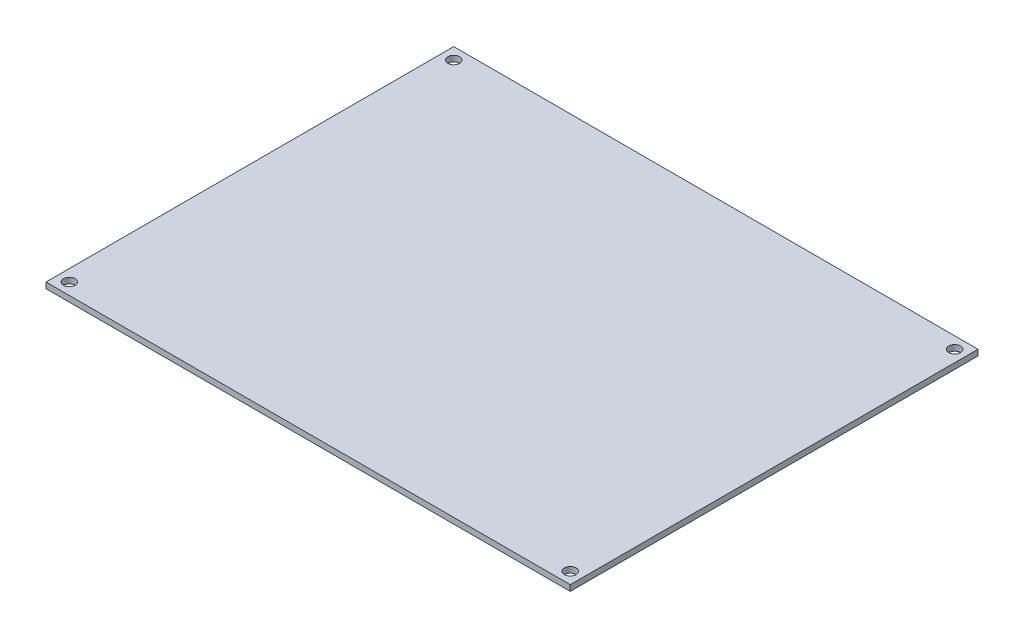
ISO-10303-21;
HEADER;
FILE_DESCRIPTION(('STEP AP214'),'2;1');
FILE_NAME('part.step','',(''),(''),'','','');
FILE_SCHEMA(('AUTOMOTIVE_DESIGN { 1 0 10303 214 1 1 1 1 }'));
ENDSEC;
DATA;
#1=APPLICATION_CONTEXT('core data for automotive mechanical design processes');
#2=APPLICATION_PROTOCOL_DEFINITION('international standard','automotive_design',2000,#1);
#3=PRODUCT_CONTEXT('',#1,'mechanical');
#4=PRODUCT('Part','Part','',(#3));
#5=PRODUCT_RELATED_PRODUCT_CATEGORY('part','',(#4));
#6=PRODUCT_DEFINITION_FORMATION('','',#4);
#7=PRODUCT_DEFINITION_CONTEXT('part definition',#1,'design');
#8=PRODUCT_DEFINITION('design','',#6,#7);
#9=PRODUCT_DEFINITION_SHAPE('','',#8);
#10=(LENGTH_UNIT() NAMED_UNIT(*) SI_UNIT(.MILLI.,.METRE.));
#11=(NAMED_UNIT(*) PLANE_ANGLE_UNIT() SI_UNIT($,.RADIAN.));
#12=(NAMED_UNIT(*) SI_UNIT($,.STERADIAN.) SOLID_ANGLE_UNIT());
#13=UNCERTAINTY_MEASURE_WITH_UNIT(LENGTH_MEASURE(1.E-05),#10,'distance_accuracy_value','');
#14=(GEOMETRIC_REPRESENTATION_CONTEXT(3) GLOBAL_UNCERTAINTY_ASSIGNED_CONTEXT((#13)) GLOBAL_UNIT_ASSIGNED_CONTEXT((#10,
#11,#12)) REPRESENTATION_CONTEXT('',''));
#15=CARTESIAN_POINT('',(0.,0.,0.));
#16=DIRECTION('',(0.,0.,1.));
#17=DIRECTION('',(1.,0.,0.));
#18=AXIS2_PLACEMENT_3D('',#15,#16,#17);
#19=CARTESIAN_POINT('',(0.,1.,0.));
#20=DIRECTION('',(1.,0.,0.));
#21=DIRECTION('',(0.,0.,-1.));
#22=AXIS2_PLACEMENT_3D('',#19,#20,#21);
#23=PLANE('',#22);
#24=DIRECTION('',(0.,0.,1.));
#25=VECTOR('',#24,1.);
#26=CARTESIAN_POINT('',(0.,0.,0.));
#27=LINE('',#26,#25);
#28=CARTESIAN_POINT('',(0.,0.,-70.));
#29=VERTEX_POINT('',#28);
#30=CARTESIAN_POINT('',(0.,0.,0.));
#31=VERTEX_POINT('',#30);
#32=EDGE_CURVE('E110',#29,#31,#27,.T.);
#33=ORIENTED_EDGE('',*,*,#32,.T.);
#34=DIRECTION('',(0.,-1.,0.));
#35=VECTOR('',#34,1.);
#36=CARTESIAN_POINT('',(0.,1.,0.));
#37=LINE('',#36,#35);
#38=CARTESIAN_POINT('',(0.,1.,0.));
#39=VERTEX_POINT('',#38);
#40=EDGE_CURVE('E11',#39,#31,#37,.T.);
#41=ORIENTED_EDGE('',*,*,#40,.F.);
#42=DIRECTION('',(0.,0.,1.));
#43=VECTOR('',#42,1.);
#44=CARTESIAN_POINT('',(0.,1.,0.));
#45=LINE('',#44,#43);
#46=CARTESIAN_POINT('',(0.,1.,-70.));
#47=VERTEX_POINT('',#46);
#48=EDGE_CURVE('E97',#47,#39,#45,.T.);
#49=ORIENTED_EDGE('',*,*,#48,.F.);
#50=DIRECTION('',(0.,-1.,0.));
#51=VECTOR('',#50,1.);
#52=CARTESIAN_POINT('',(0.,1.,-70.));
#53=LINE('',#52,#51);
#54=EDGE_CURVE('E106',#47,#29,#53,.T.);
#55=ORIENTED_EDGE('',*,*,#54,.T.);
#56=EDGE_LOOP('',(#33,#41,#49,#55));
#57=FACE_BOUND('',#56,.T.);
#58=ADVANCED_FACE('F44',(#57),#23,.F.);
#59=CARTESIAN_POINT('',(0.,1.,0.));
#60=DIRECTION('',(0.,0.,-1.));
#61=DIRECTION('',(-1.,0.,0.));
#62=AXIS2_PLACEMENT_3D('',#59,#60,#61);
#63=PLANE('',#62);
#64=DIRECTION('',(1.,0.,0.));
#65=VECTOR('',#64,1.);
#66=CARTESIAN_POINT('',(0.,0.,0.));
#67=LINE('',#66,#65);
#68=CARTESIAN_POINT('',(90.,0.,0.));
#69=VERTEX_POINT('',#68);
#70=EDGE_CURVE('E101',#31,#69,#67,.T.);
#71=ORIENTED_EDGE('',*,*,#70,.T.);
#72=DIRECTION('',(0.,-1.,0.));
#73=VECTOR('',#72,1.);
#74=CARTESIAN_POINT('',(90.,1.,0.));
#75=LINE('',#74,#73);
#76=CARTESIAN_POINT('',(90.,1.,0.));
#77=VERTEX_POINT('',#76);
#78=EDGE_CURVE('E53',#77,#69,#75,.T.);
#79=ORIENTED_EDGE('',*,*,#78,.F.);
#80=DIRECTION('',(1.,0.,0.));
#81=VECTOR('',#80,1.);
#82=CARTESIAN_POINT('',(0.,1.,0.));
#83=LINE('',#82,#81);
#84=EDGE_CURVE('E92',#39,#77,#83,.T.);
#85=ORIENTED_EDGE('',*,*,#84,.F.);
#86=ORIENTED_EDGE('',*,*,#40,.T.);
#87=EDGE_LOOP('',(#71,#79,#85,#86));
#88=FACE_BOUND('',#87,.T.);
#89=ADVANCED_FACE('F100',(#88),#63,.F.);
#90=CARTESIAN_POINT('',(90.,1.,0.));
#91=DIRECTION('',(-1.,0.,0.));
#92=DIRECTION('',(0.,0.,1.));
#93=AXIS2_PLACEMENT_3D('',#90,#91,#92);
#94=PLANE('',#93);
#95=DIRECTION('',(0.,0.,-1.));
#96=VECTOR('',#95,1.);
#97=CARTESIAN_POINT('',(90.,0.,0.));
#98=LINE('',#97,#96);
#99=CARTESIAN_POINT('',(90.,0.,-70.));
#100=VERTEX_POINT('',#99);
#101=EDGE_CURVE('E79',#69,#100,#98,.T.);
#102=ORIENTED_EDGE('',*,*,#101,.T.);
#103=DIRECTION('',(0.,-1.,0.));
#104=VECTOR('',#103,1.);
#105=CARTESIAN_POINT('',(90.,1.,-70.));
#106=LINE('',#105,#104);
#107=CARTESIAN_POINT('',(90.,1.,-70.));
#108=VERTEX_POINT('',#107);
#109=EDGE_CURVE('E102',#108,#100,#106,.T.);
#110=ORIENTED_EDGE('',*,*,#109,.F.);
#111=DIRECTION('',(0.,0.,-1.));
#112=VECTOR('',#111,1.);
#113=CARTESIAN_POINT('',(90.,1.,0.));
#114=LINE('',#113,#112);
#115=EDGE_CURVE('E95',#77,#108,#114,.T.);
#116=ORIENTED_EDGE('',*,*,#115,.F.);
#117=ORIENTED_EDGE('',*,*,#78,.T.);
#118=EDGE_LOOP('',(#102,#110,#116,#117));
#119=FACE_BOUND('',#118,.T.);
#120=ADVANCED_FACE('F104',(#119),#94,.F.);
#121=CARTESIAN_POINT('',(0.,1.,-70.));
#122=DIRECTION('',(0.,0.,1.));
#123=DIRECTION('',(1.,0.,0.));
#124=AXIS2_PLACEMENT_3D('',#121,#122,#123);
#125=PLANE('',#124);
#126=DIRECTION('',(-1.,0.,0.));
#127=VECTOR('',#126,1.);
#128=CARTESIAN_POINT('',(0.,0.,-70.));
#129=LINE('',#128,#127);
#130=EDGE_CURVE('E85',#100,#29,#129,.T.);
#131=ORIENTED_EDGE('',*,*,#130,.T.);
#132=ORIENTED_EDGE('',*,*,#54,.F.);
#133=DIRECTION('',(-1.,0.,0.));
#134=VECTOR('',#133,1.);
#135=CARTESIAN_POINT('',(0.,1.,-70.));
#136=LINE('',#135,#134);
#137=EDGE_CURVE('E62',#108,#47,#136,.T.);
#138=ORIENTED_EDGE('',*,*,#137,.F.);
#139=ORIENTED_EDGE('',*,*,#109,.T.);
#140=EDGE_LOOP('',(#131,#132,#138,#139));
#141=FACE_BOUND('',#140,.T.);
#142=ADVANCED_FACE('F146',(#141),#125,.F.);
#143=CARTESIAN_POINT('',(0.,1.,0.));
#144=DIRECTION('',(0.,-1.,0.));
#145=DIRECTION('',(0.,0.,-1.));
#146=AXIS2_PLACEMENT_3D('',#143,#144,#145);
#147=PLANE('',#146);
#148=CARTESIAN_POINT('',(2.,1.,-68.));
#149=DIRECTION('',(0.,1.,0.));
#150=DIRECTION('',(0.,0.,1.));
#151=AXIS2_PLACEMENT_3D('',#148,#149,#150);
#152=CIRCLE('',#151,1.);
#153=CARTESIAN_POINT('',(2.,1.,-67.));
#154=VERTEX_POINT('',#153);
#155=EDGE_CURVE('E254',#154,#154,#152,.T.);
#156=ORIENTED_EDGE('',*,*,#155,.F.);
#157=EDGE_LOOP('',(#156));
#158=FACE_BOUND('',#157,.T.);
#159=CARTESIAN_POINT('',(2.,1.,-2.00000000000001));
#160=DIRECTION('',(0.,1.,0.));
#161=DIRECTION('',(0.,0.,1.));
#162=AXIS2_PLACEMENT_3D('',#159,#160,#161);
#163=CIRCLE('',#162,1.);
#164=CARTESIAN_POINT('',(2.,1.,-1.00000000000001));
#165=VERTEX_POINT('',#164);
#166=EDGE_CURVE('E251',#165,#165,#163,.T.);
#167=ORIENTED_EDGE('',*,*,#166,.F.);
#168=EDGE_LOOP('',(#167));
#169=FACE_BOUND('',#168,.T.);
#170=CARTESIAN_POINT('',(88.,1.,-2.00000000000001));
#171=DIRECTION('',(0.,1.,0.));
#172=DIRECTION('',(0.,0.,1.));
#173=AXIS2_PLACEMENT_3D('',#170,#171,#172);
#174=CIRCLE('',#173,0.999999999999998);
#175=CARTESIAN_POINT('',(88.,1.,-1.00000000000001));
#176=VERTEX_POINT('',#175);
#177=EDGE_CURVE('E253',#176,#176,#174,.T.);
#178=ORIENTED_EDGE('',*,*,#177,.F.);
#179=EDGE_LOOP('',(#178));
#180=FACE_BOUND('',#179,.T.);
#181=CARTESIAN_POINT('',(88.,1.,-68.));
#182=DIRECTION('',(0.,1.,0.));
#183=DIRECTION('',(0.,0.,1.));
#184=AXIS2_PLACEMENT_3D('',#181,#182,#183);
#185=CIRCLE('',#184,0.999999999999998);
#186=CARTESIAN_POINT('',(88.,1.,-67.));
#187=VERTEX_POINT('',#186);
#188=EDGE_CURVE('E122',#187,#187,#185,.T.);
#189=ORIENTED_EDGE('',*,*,#188,.F.);
#190=EDGE_LOOP('',(#189));
#191=FACE_BOUND('',#190,.T.);
#192=ORIENTED_EDGE('',*,*,#48,.T.);
#193=ORIENTED_EDGE('',*,*,#84,.T.);
#194=ORIENTED_EDGE('',*,*,#115,.T.);
#195=ORIENTED_EDGE('',*,*,#137,.T.);
#196=EDGE_LOOP('',(#192,#193,#194,#195));
#197=FACE_BOUND('',#196,.T.);
#198=ADVANCED_FACE('F93',(#158,#169,#180,#191,#197),#147,.F.);
#199=CARTESIAN_POINT('',(0.,0.,0.));
#200=DIRECTION('',(0.,-1.,0.));
#201=DIRECTION('',(0.,0.,-1.));
#202=AXIS2_PLACEMENT_3D('',#199,#200,#201);
#203=PLANE('',#202);
#204=CARTESIAN_POINT('',(2.,0.,-68.));
#205=DIRECTION('',(0.,-1.,0.));
#206=DIRECTION('',(0.,0.,-1.));
#207=AXIS2_PLACEMENT_3D('',#204,#205,#206);
#208=CIRCLE('',#207,1.);
#209=CARTESIAN_POINT('',(2.,0.,-69.));
#210=VERTEX_POINT('',#209);
#211=EDGE_CURVE('E47',#210,#210,#208,.T.);
#212=ORIENTED_EDGE('',*,*,#211,.F.);
#213=EDGE_LOOP('',(#212));
#214=FACE_BOUND('',#213,.T.);
#215=CARTESIAN_POINT('',(2.,0.,-2.00000000000001));
#216=DIRECTION('',(0.,-1.,0.));
#217=DIRECTION('',(0.,0.,-1.));
#218=AXIS2_PLACEMENT_3D('',#215,#216,#217);
#219=CIRCLE('',#218,1.);
#220=CARTESIAN_POINT('',(2.,0.,-3.00000000000001));
#221=VERTEX_POINT('',#220);
#222=EDGE_CURVE('E124',#221,#221,#219,.T.);
#223=ORIENTED_EDGE('',*,*,#222,.F.);
#224=EDGE_LOOP('',(#223));
#225=FACE_BOUND('',#224,.T.);
#226=CARTESIAN_POINT('',(88.,0.,-2.00000000000001));
#227=DIRECTION('',(0.,-1.,0.));
#228=DIRECTION('',(0.,0.,-1.));
#229=AXIS2_PLACEMENT_3D('',#226,#227,#228);
#230=CIRCLE('',#229,0.999999999999998);
#231=CARTESIAN_POINT('',(88.,0.,-3.00000000000001));
#232=VERTEX_POINT('',#231);
#233=EDGE_CURVE('E121',#232,#232,#230,.T.);
#234=ORIENTED_EDGE('',*,*,#233,.F.);
#235=EDGE_LOOP('',(#234));
#236=FACE_BOUND('',#235,.T.);
#237=CARTESIAN_POINT('',(88.,0.,-68.));
#238=DIRECTION('',(0.,-1.,0.));
#239=DIRECTION('',(0.,0.,-1.));
#240=AXIS2_PLACEMENT_3D('',#237,#238,#239);
#241=CIRCLE('',#240,0.999999999999998);
#242=CARTESIAN_POINT('',(88.,0.,-69.));
#243=VERTEX_POINT('',#242);
#244=EDGE_CURVE('E118',#243,#243,#241,.T.);
#245=ORIENTED_EDGE('',*,*,#244,.F.);
#246=EDGE_LOOP('',(#245));
#247=FACE_BOUND('',#246,.T.);
#248=ORIENTED_EDGE('',*,*,#32,.F.);
#249=ORIENTED_EDGE('',*,*,#130,.F.);
#250=ORIENTED_EDGE('',*,*,#101,.F.);
#251=ORIENTED_EDGE('',*,*,#70,.F.);
#252=EDGE_LOOP('',(#248,#249,#250,#251));
#253=FACE_BOUND('',#252,.T.);
#254=ADVANCED_FACE('F134',(#214,#225,#236,#247,#253),#203,.T.);
#255=CARTESIAN_POINT('',(88.,-9.,-68.));
#256=DIRECTION('',(0.,1.,0.));
#257=DIRECTION('',(0.,0.,1.));
#258=AXIS2_PLACEMENT_3D('',#255,#256,#257);
#259=CYLINDRICAL_SURFACE('',#258,0.999999999999998);
#260=ORIENTED_EDGE('',*,*,#244,.T.);
#261=EDGE_LOOP('',(#260));
#262=FACE_BOUND('',#261,.T.);
#263=ORIENTED_EDGE('',*,*,#188,.T.);
#264=EDGE_LOOP('',(#263));
#265=FACE_BOUND('',#264,.T.);
#266=ADVANCED_FACE('F137',(#262,#265),#259,.F.);
#267=CARTESIAN_POINT('',(88.,-9.,-2.00000000000001));
#268=DIRECTION('',(0.,1.,0.));
#269=DIRECTION('',(0.,0.,1.));
#270=AXIS2_PLACEMENT_3D('',#267,#268,#269);
#271=CYLINDRICAL_SURFACE('',#270,0.999999999999998);
#272=ORIENTED_EDGE('',*,*,#233,.T.);
#273=EDGE_LOOP('',(#272));
#274=FACE_BOUND('',#273,.T.);
#275=ORIENTED_EDGE('',*,*,#177,.T.);
#276=EDGE_LOOP('',(#275));
#277=FACE_BOUND('',#276,.T.);
#278=ADVANCED_FACE('F189',(#274,#277),#271,.F.);
#279=CARTESIAN_POINT('',(2.,-9.,-2.00000000000001));
#280=DIRECTION('',(0.,1.,0.));
#281=DIRECTION('',(0.,0.,1.));
#282=AXIS2_PLACEMENT_3D('',#279,#280,#281);
#283=CYLINDRICAL_SURFACE('',#282,1.);
#284=ORIENTED_EDGE('',*,*,#222,.T.);
#285=EDGE_LOOP('',(#284));
#286=FACE_BOUND('',#285,.T.);
#287=ORIENTED_EDGE('',*,*,#166,.T.);
#288=EDGE_LOOP('',(#287));
#289=FACE_BOUND('',#288,.T.);
#290=ADVANCED_FACE('F200',(#286,#289),#283,.F.);
#291=CARTESIAN_POINT('',(2.,-9.,-68.));
#292=DIRECTION('',(0.,1.,0.));
#293=DIRECTION('',(0.,0.,1.));
#294=AXIS2_PLACEMENT_3D('',#291,#292,#293);
#295=CYLINDRICAL_SURFACE('',#294,1.);
#296=ORIENTED_EDGE('',*,*,#211,.T.);
#297=EDGE_LOOP('',(#296));
#298=FACE_BOUND('',#297,.T.);
#299=ORIENTED_EDGE('',*,*,#155,.T.);
#300=EDGE_LOOP('',(#299));
#301=FACE_BOUND('',#300,.T.);
#302=ADVANCED_FACE('F131',(#298,#301),#295,.F.);
#303=CLOSED_SHELL('',(#58,#89,#120,#142,#198,#254,#266,#278,#290,#302));
#304=MANIFOLD_SOLID_BREP('B2',#303);
#305=ADVANCED_BREP_SHAPE_REPRESENTATION('',(#18,#304),#14);
#306=SHAPE_DEFINITION_REPRESENTATION(#9,#305);
ENDSEC;
END-ISO-10303-21;
